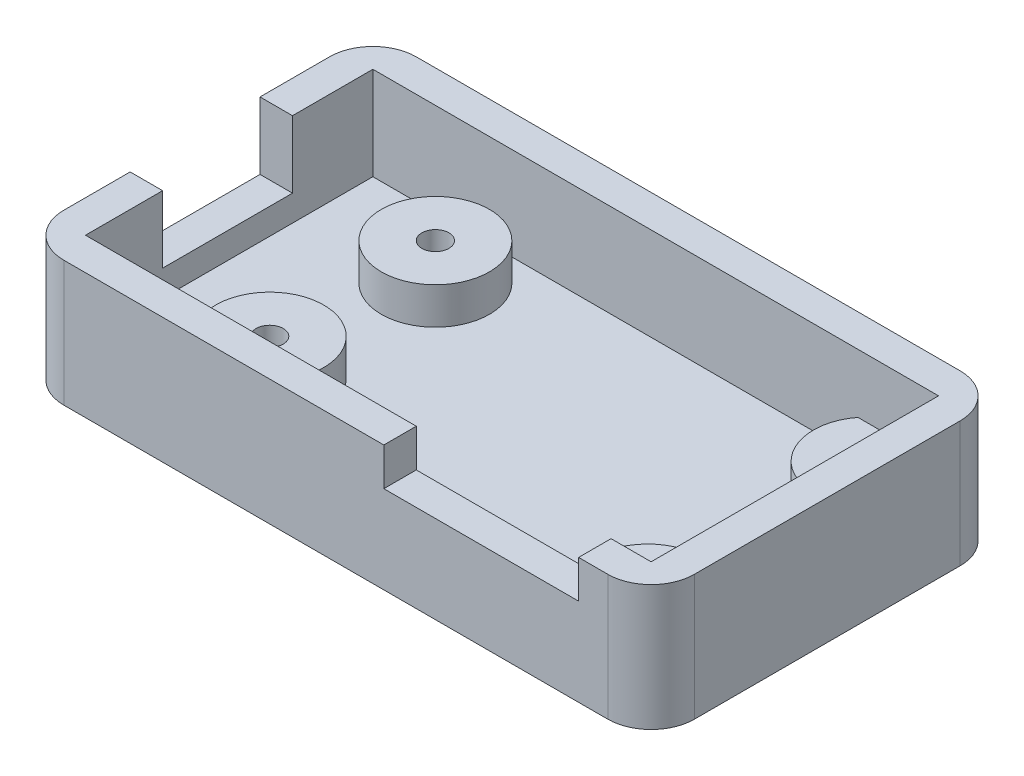
ISO-10303-21;
HEADER;
FILE_DESCRIPTION(('STEP AP214'),'2;1');
FILE_NAME('part.step','',(''),(''),'','','');
FILE_SCHEMA(('AUTOMOTIVE_DESIGN { 1 0 10303 214 1 1 1 1 }'));
ENDSEC;
DATA;
#1=APPLICATION_CONTEXT('core data for automotive mechanical design processes');
#2=APPLICATION_PROTOCOL_DEFINITION('international standard','automotive_design',2000,#1);
#3=PRODUCT_CONTEXT('',#1,'mechanical');
#4=PRODUCT('Part','Part','',(#3));
#5=PRODUCT_RELATED_PRODUCT_CATEGORY('part','',(#4));
#6=PRODUCT_DEFINITION_FORMATION('','',#4);
#7=PRODUCT_DEFINITION_CONTEXT('part definition',#1,'design');
#8=PRODUCT_DEFINITION('design','',#6,#7);
#9=PRODUCT_DEFINITION_SHAPE('','',#8);
#10=(LENGTH_UNIT() NAMED_UNIT(*) SI_UNIT(.MILLI.,.METRE.));
#11=(NAMED_UNIT(*) PLANE_ANGLE_UNIT() SI_UNIT($,.RADIAN.));
#12=(NAMED_UNIT(*) SI_UNIT($,.STERADIAN.) SOLID_ANGLE_UNIT());
#13=UNCERTAINTY_MEASURE_WITH_UNIT(LENGTH_MEASURE(1.E-05),#10,'distance_accuracy_value','');
#14=(GEOMETRIC_REPRESENTATION_CONTEXT(3) GLOBAL_UNCERTAINTY_ASSIGNED_CONTEXT((#13)) GLOBAL_UNIT_ASSIGNED_CONTEXT((#10,
#11,#12)) REPRESENTATION_CONTEXT('',''));
#15=CARTESIAN_POINT('',(0.,0.,0.));
#16=DIRECTION('',(0.,0.,1.));
#17=DIRECTION('',(1.,0.,0.));
#18=AXIS2_PLACEMENT_3D('',#15,#16,#17);
#19=CARTESIAN_POINT('',(-0.75,11.6,0.749999999999999));
#20=DIRECTION('',(0.,1.,0.));
#21=DIRECTION('',(0.,0.,1.));
#22=AXIS2_PLACEMENT_3D('',#19,#20,#21);
#23=PLANE('',#22);
#24=DIRECTION('',(1.,0.,0.));
#25=VECTOR('',#24,1.);
#26=CARTESIAN_POINT('',(-55.021,11.6,19.17934126));
#27=LINE('',#26,#25);
#28=CARTESIAN_POINT('',(-55.02,11.6,19.17934126));
#29=VERTEX_POINT('',#28);
#30=CARTESIAN_POINT('',(-52.02,11.6,19.17934126));
#31=VERTEX_POINT('',#30);
#32=EDGE_CURVE('E306',#29,#31,#27,.T.);
#33=ORIENTED_EDGE('',*,*,#32,.F.);
#34=DIRECTION('',(0.,0.,-1.));
#35=VECTOR('',#34,1.);
#36=CARTESIAN_POINT('',(-55.02,11.6,0.750000000000007));
#37=LINE('',#36,#35);
#38=CARTESIAN_POINT('',(-55.02,11.6,25.31));
#39=VERTEX_POINT('',#38);
#40=EDGE_CURVE('E311',#39,#29,#37,.T.);
#41=ORIENTED_EDGE('',*,*,#40,.F.);
#42=CARTESIAN_POINT('',(-51.02,11.6,25.31));
#43=DIRECTION('',(0.,1.,0.));
#44=DIRECTION('',(0.,0.,1.));
#45=AXIS2_PLACEMENT_3D('',#42,#43,#44);
#46=CIRCLE('',#45,4.);
#47=CARTESIAN_POINT('',(-51.02,11.6,29.31));
#48=VERTEX_POINT('',#47);
#49=EDGE_CURVE('E529',#39,#48,#46,.T.);
#50=ORIENTED_EDGE('',*,*,#49,.T.);
#51=DIRECTION('',(1.,0.,0.));
#52=VECTOR('',#51,1.);
#53=CARTESIAN_POINT('',(-51.02,11.6,29.31));
#54=LINE('',#53,#52);
#55=CARTESIAN_POINT('',(-21.45,11.6,29.31));
#56=VERTEX_POINT('',#55);
#57=EDGE_CURVE('E525',#48,#56,#54,.T.);
#58=ORIENTED_EDGE('',*,*,#57,.T.);
#59=DIRECTION('',(0.,0.,-1.));
#60=VECTOR('',#59,1.);
#61=CARTESIAN_POINT('',(-21.45,11.6,29.311));
#62=LINE('',#61,#60);
#63=CARTESIAN_POINT('',(-21.45,11.6,26.31));
#64=VERTEX_POINT('',#63);
#65=EDGE_CURVE('E356',#56,#64,#62,.T.);
#66=ORIENTED_EDGE('',*,*,#65,.T.);
#67=DIRECTION('',(1.,0.,0.));
#68=VECTOR('',#67,1.);
#69=CARTESIAN_POINT('',(-51.02,11.6,26.31));
#70=LINE('',#69,#68);
#71=CARTESIAN_POINT('',(-52.02,11.6,26.31));
#72=VERTEX_POINT('',#71);
#73=EDGE_CURVE('E477',#72,#64,#70,.T.);
#74=ORIENTED_EDGE('',*,*,#73,.F.);
#75=DIRECTION('',(0.,0.,-1.));
#76=VECTOR('',#75,1.);
#77=CARTESIAN_POINT('',(-52.02,11.6,0.750000000000006));
#78=LINE('',#77,#76);
#79=EDGE_CURVE('E463',#72,#31,#78,.T.);
#80=ORIENTED_EDGE('',*,*,#79,.T.);
#81=EDGE_LOOP('',(#33,#41,#50,#58,#66,#74,#80));
#82=FACE_BOUND('',#81,.T.);
#83=ADVANCED_FACE('F113',(#82),#23,.T.);
#84=CARTESIAN_POINT('',(-51.02,3.,0.750000000000006));
#85=DIRECTION('',(0.,1.,0.));
#86=DIRECTION('',(0.,0.,1.));
#87=AXIS2_PLACEMENT_3D('',#84,#85,#86);
#88=PLANE('',#87);
#89=DIRECTION('',(1.,0.,0.));
#90=VECTOR('',#89,1.);
#91=CARTESIAN_POINT('',(-51.02,3.,26.06));
#92=LINE('',#91,#90);
#93=CARTESIAN_POINT('',(-7.21608990664734,3.,26.06));
#94=VERTEX_POINT('',#93);
#95=CARTESIAN_POINT('',(0.,3.,26.06));
#96=VERTEX_POINT('',#95);
#97=EDGE_CURVE('E388',#94,#96,#92,.T.);
#98=ORIENTED_EDGE('',*,*,#97,.F.);
#99=CARTESIAN_POINT('',(-2.995,3.,23.38));
#100=DIRECTION('',(0.,1.,0.));
#101=DIRECTION('',(0.,0.,1.));
#102=AXIS2_PLACEMENT_3D('',#99,#100,#101);
#103=CIRCLE('',#102,5.);
#104=CARTESIAN_POINT('',(0.,3.,19.3762548782421));
#105=VERTEX_POINT('',#104);
#106=EDGE_CURVE('E372',#105,#94,#103,.T.);
#107=ORIENTED_EDGE('',*,*,#106,.F.);
#108=DIRECTION('',(0.,0.,-1.));
#109=VECTOR('',#108,1.);
#110=CARTESIAN_POINT('',(0.,3.,0.750000000000006));
#111=LINE('',#110,#109);
#112=EDGE_CURVE('E378',#96,#105,#111,.T.);
#113=ORIENTED_EDGE('',*,*,#112,.F.);
#114=EDGE_LOOP('',(#98,#107,#113));
#115=FACE_BOUND('',#114,.T.);
#116=CARTESIAN_POINT('',(-40.62,3.,20.685));
#117=DIRECTION('',(0.,1.,0.));
#118=DIRECTION('',(0.,0.,1.));
#119=AXIS2_PLACEMENT_3D('',#116,#117,#118);
#120=CIRCLE('',#119,5.);
#121=CARTESIAN_POINT('',(-40.62,3.,25.685));
#122=VERTEX_POINT('',#121);
#123=EDGE_CURVE('E407',#122,#122,#120,.T.);
#124=ORIENTED_EDGE('',*,*,#123,.F.);
#125=EDGE_LOOP('',(#124));
#126=FACE_BOUND('',#125,.T.);
#127=CARTESIAN_POINT('',(-40.62,3.,5.375));
#128=DIRECTION('',(0.,1.,0.));
#129=DIRECTION('',(0.,0.,1.));
#130=AXIS2_PLACEMENT_3D('',#127,#128,#129);
#131=CIRCLE('',#130,5.);
#132=CARTESIAN_POINT('',(-40.62,3.,10.375));
#133=VERTEX_POINT('',#132);
#134=EDGE_CURVE('E419',#133,#133,#131,.T.);
#135=ORIENTED_EDGE('',*,*,#134,.F.);
#136=EDGE_LOOP('',(#135));
#137=FACE_BOUND('',#136,.T.);
#138=DIRECTION('',(1.,0.,0.));
#139=VECTOR('',#138,1.);
#140=CARTESIAN_POINT('',(-51.02,3.,-0.25));
#141=LINE('',#140,#139);
#142=CARTESIAN_POINT('',(-52.02,3.,-0.25));
#143=VERTEX_POINT('',#142);
#144=CARTESIAN_POINT('',(0.25,3.,-0.249999999999999));
#145=VERTEX_POINT('',#144);
#146=EDGE_CURVE('E485',#143,#145,#141,.T.);
#147=ORIENTED_EDGE('',*,*,#146,.F.);
#148=DIRECTION('',(0.,0.,-1.));
#149=VECTOR('',#148,1.);
#150=CARTESIAN_POINT('',(-52.02,3.,0.750000000000006));
#151=LINE('',#150,#149);
#152=CARTESIAN_POINT('',(-52.02,3.,26.31));
#153=VERTEX_POINT('',#152);
#154=EDGE_CURVE('E457',#153,#143,#151,.T.);
#155=ORIENTED_EDGE('',*,*,#154,.F.);
#156=DIRECTION('',(1.,0.,0.));
#157=VECTOR('',#156,1.);
#158=CARTESIAN_POINT('',(-51.02,3.,26.31));
#159=LINE('',#158,#157);
#160=CARTESIAN_POINT('',(0.25,3.,26.31));
#161=VERTEX_POINT('',#160);
#162=EDGE_CURVE('E493',#153,#161,#159,.T.);
#163=ORIENTED_EDGE('',*,*,#162,.T.);
#164=DIRECTION('',(0.,0.,-1.));
#165=VECTOR('',#164,1.);
#166=CARTESIAN_POINT('',(0.25,3.,0.750000000000006));
#167=LINE('',#166,#165);
#168=EDGE_CURVE('E489',#161,#145,#167,.T.);
#169=ORIENTED_EDGE('',*,*,#168,.T.);
#170=EDGE_LOOP('',(#147,#155,#163,#169));
#171=FACE_BOUND('',#170,.T.);
#172=DIRECTION('',(1.,0.,0.));
#173=VECTOR('',#172,1.);
#174=CARTESIAN_POINT('',(-51.02,3.,0.));
#175=LINE('',#174,#173);
#176=CARTESIAN_POINT('',(-6.94928881089887,3.,0.));
#177=VERTEX_POINT('',#176);
#178=CARTESIAN_POINT('',(0.,3.,0.));
#179=VERTEX_POINT('',#178);
#180=EDGE_CURVE('E431',#177,#179,#175,.T.);
#181=ORIENTED_EDGE('',*,*,#180,.T.);
#182=DIRECTION('',(0.,0.,-1.));
#183=VECTOR('',#182,1.);
#184=CARTESIAN_POINT('',(0.,3.,0.750000000000006));
#185=LINE('',#184,#183);
#186=CARTESIAN_POINT('',(0.,3.,7.06374512175788));
#187=VERTEX_POINT('',#186);
#188=EDGE_CURVE('E447',#187,#179,#185,.T.);
#189=ORIENTED_EDGE('',*,*,#188,.F.);
#190=CARTESIAN_POINT('',(-2.995,3.,3.06));
#191=DIRECTION('',(0.,1.,0.));
#192=DIRECTION('',(0.,0.,1.));
#193=AXIS2_PLACEMENT_3D('',#190,#191,#192);
#194=CIRCLE('',#193,5.);
#195=EDGE_CURVE('E437',#177,#187,#194,.T.);
#196=ORIENTED_EDGE('',*,*,#195,.F.);
#197=EDGE_LOOP('',(#181,#189,#196));
#198=FACE_BOUND('',#197,.T.);
#199=ADVANCED_FACE('F642',(#115,#126,#137,#171,#198),#88,.T.);
#200=CARTESIAN_POINT('',(-51.02,3.,0.750000000000006));
#201=DIRECTION('',(0.,-1.,0.));
#202=DIRECTION('',(0.,0.,-1.));
#203=AXIS2_PLACEMENT_3D('',#200,#201,#202);
#204=CYLINDRICAL_SURFACE('',#203,4.);
#205=CARTESIAN_POINT('',(-51.02,0.,0.750000000000006));
#206=DIRECTION('',(0.,1.,0.));
#207=DIRECTION('',(0.,0.,1.));
#208=AXIS2_PLACEMENT_3D('',#205,#206,#207);
#209=CIRCLE('',#208,4.);
#210=CARTESIAN_POINT('',(-51.02,0.,-3.24999999999999));
#211=VERTEX_POINT('',#210);
#212=CARTESIAN_POINT('',(-55.02,0.,0.750000000000035));
#213=VERTEX_POINT('',#212);
#214=EDGE_CURVE('E540',#211,#213,#209,.T.);
#215=ORIENTED_EDGE('',*,*,#214,.T.);
#216=DIRECTION('',(0.,-1.,0.));
#217=VECTOR('',#216,1.);
#218=CARTESIAN_POINT('',(-55.02,3.,0.750000000000035));
#219=LINE('',#218,#217);
#220=CARTESIAN_POINT('',(-55.02,11.6,0.750000000000034));
#221=VERTEX_POINT('',#220);
#222=EDGE_CURVE('E12',#221,#213,#219,.T.);
#223=ORIENTED_EDGE('',*,*,#222,.F.);
#224=CARTESIAN_POINT('',(-51.02,11.6,0.750000000000006));
#225=DIRECTION('',(0.,1.,0.));
#226=DIRECTION('',(0.,0.,1.));
#227=AXIS2_PLACEMENT_3D('',#224,#225,#226);
#228=CIRCLE('',#227,4.);
#229=CARTESIAN_POINT('',(-51.02,11.6,-3.24999999999999));
#230=VERTEX_POINT('',#229);
#231=EDGE_CURVE('E536',#230,#221,#228,.T.);
#232=ORIENTED_EDGE('',*,*,#231,.F.);
#233=DIRECTION('',(0.,-1.,0.));
#234=VECTOR('',#233,1.);
#235=CARTESIAN_POINT('',(-51.02,3.,-3.24999999999999));
#236=LINE('',#235,#234);
#237=EDGE_CURVE('E570',#230,#211,#236,.T.);
#238=ORIENTED_EDGE('',*,*,#237,.T.);
#239=EDGE_LOOP('',(#215,#223,#232,#238));
#240=FACE_BOUND('',#239,.T.);
#241=ADVANCED_FACE('F115',(#240),#204,.T.);
#242=CARTESIAN_POINT('',(-55.02,3.,0.750000000000035));
#243=DIRECTION('',(1.,0.,0.));
#244=DIRECTION('',(0.,0.,-1.));
#245=AXIS2_PLACEMENT_3D('',#242,#243,#244);
#246=PLANE('',#245);
#247=ORIENTED_EDGE('',*,*,#40,.T.);
#248=DIRECTION('',(0.,1.,0.));
#249=VECTOR('',#248,1.);
#250=CARTESIAN_POINT('',(-55.02,11.6,19.17934126));
#251=LINE('',#250,#249);
#252=CARTESIAN_POINT('',(-55.02,5.4,19.17934126));
#253=VERTEX_POINT('',#252);
#254=EDGE_CURVE('E289',#253,#29,#251,.T.);
#255=ORIENTED_EDGE('',*,*,#254,.F.);
#256=DIRECTION('',(0.,0.,1.));
#257=VECTOR('',#256,1.);
#258=CARTESIAN_POINT('',(-55.02,5.4,19.17934126));
#259=LINE('',#258,#257);
#260=CARTESIAN_POINT('',(-55.02,5.4,7.17934126));
#261=VERTEX_POINT('',#260);
#262=EDGE_CURVE('E299',#261,#253,#259,.T.);
#263=ORIENTED_EDGE('',*,*,#262,.F.);
#264=DIRECTION('',(0.,-1.,0.));
#265=VECTOR('',#264,1.);
#266=CARTESIAN_POINT('',(-55.02,11.6,7.17934126));
#267=LINE('',#266,#265);
#268=CARTESIAN_POINT('',(-55.02,11.6,7.17934126));
#269=VERTEX_POINT('',#268);
#270=EDGE_CURVE('E313',#269,#261,#267,.T.);
#271=ORIENTED_EDGE('',*,*,#270,.F.);
#272=EDGE_CURVE('E533',#269,#221,#37,.T.);
#273=ORIENTED_EDGE('',*,*,#272,.T.);
#274=ORIENTED_EDGE('',*,*,#222,.T.);
#275=DIRECTION('',(0.,0.,1.));
#276=VECTOR('',#275,1.);
#277=CARTESIAN_POINT('',(-55.02,0.,0.750000000000035));
#278=LINE('',#277,#276);
#279=CARTESIAN_POINT('',(-55.02,0.,25.31));
#280=VERTEX_POINT('',#279);
#281=EDGE_CURVE('E544',#213,#280,#278,.T.);
#282=ORIENTED_EDGE('',*,*,#281,.T.);
#283=DIRECTION('',(0.,-1.,0.));
#284=VECTOR('',#283,1.);
#285=CARTESIAN_POINT('',(-55.02,3.,25.31));
#286=LINE('',#285,#284);
#287=EDGE_CURVE('E122',#39,#280,#286,.T.);
#288=ORIENTED_EDGE('',*,*,#287,.F.);
#289=EDGE_LOOP('',(#247,#255,#263,#271,#273,#274,#282,#288));
#290=FACE_BOUND('',#289,.T.);
#291=ADVANCED_FACE('F309',(#290),#246,.F.);
#292=CARTESIAN_POINT('',(-51.02,3.,25.31));
#293=DIRECTION('',(0.,-1.,0.));
#294=DIRECTION('',(0.,0.,-1.));
#295=AXIS2_PLACEMENT_3D('',#292,#293,#294);
#296=CYLINDRICAL_SURFACE('',#295,4.);
#297=CARTESIAN_POINT('',(-51.02,0.,25.31));
#298=DIRECTION('',(0.,1.,0.));
#299=DIRECTION('',(0.,0.,1.));
#300=AXIS2_PLACEMENT_3D('',#297,#298,#299);
#301=CIRCLE('',#300,4.);
#302=CARTESIAN_POINT('',(-51.02,0.,29.31));
#303=VERTEX_POINT('',#302);
#304=EDGE_CURVE('E547',#280,#303,#301,.T.);
#305=ORIENTED_EDGE('',*,*,#304,.T.);
#306=DIRECTION('',(0.,-1.,0.));
#307=VECTOR('',#306,1.);
#308=CARTESIAN_POINT('',(-51.02,3.,29.31));
#309=LINE('',#308,#307);
#310=EDGE_CURVE('E586',#48,#303,#309,.T.);
#311=ORIENTED_EDGE('',*,*,#310,.F.);
#312=ORIENTED_EDGE('',*,*,#49,.F.);
#313=ORIENTED_EDGE('',*,*,#287,.T.);
#314=EDGE_LOOP('',(#305,#311,#312,#313));
#315=FACE_BOUND('',#314,.T.);
#316=ADVANCED_FACE('F593',(#315),#296,.T.);
#317=CARTESIAN_POINT('',(-0.750000000000025,3.,29.31));
#318=DIRECTION('',(0.,0.,1.));
#319=DIRECTION('',(1.,0.,0.));
#320=AXIS2_PLACEMENT_3D('',#317,#318,#319);
#321=PLANE('',#320);
#322=DIRECTION('',(0.,-1.,0.));
#323=VECTOR('',#322,1.);
#324=CARTESIAN_POINT('',(-3.45,11.6,29.31));
#325=LINE('',#324,#323);
#326=CARTESIAN_POINT('',(-3.45,11.6,29.31));
#327=VERTEX_POINT('',#326);
#328=CARTESIAN_POINT('',(-3.45,8.1,29.31));
#329=VERTEX_POINT('',#328);
#330=EDGE_CURVE('E338',#327,#329,#325,.T.);
#331=ORIENTED_EDGE('',*,*,#330,.T.);
#332=DIRECTION('',(-1.,0.,0.));
#333=VECTOR('',#332,1.);
#334=CARTESIAN_POINT('',(-3.45,8.1,29.31));
#335=LINE('',#334,#333);
#336=CARTESIAN_POINT('',(-21.45,8.1,29.31));
#337=VERTEX_POINT('',#336);
#338=EDGE_CURVE('E355',#329,#337,#335,.T.);
#339=ORIENTED_EDGE('',*,*,#338,.T.);
#340=DIRECTION('',(0.,1.,0.));
#341=VECTOR('',#340,1.);
#342=CARTESIAN_POINT('',(-21.45,11.6,29.31));
#343=LINE('',#342,#341);
#344=EDGE_CURVE('E305',#337,#56,#343,.T.);
#345=ORIENTED_EDGE('',*,*,#344,.T.);
#346=ORIENTED_EDGE('',*,*,#57,.F.);
#347=ORIENTED_EDGE('',*,*,#310,.T.);
#348=DIRECTION('',(-1.,0.,0.));
#349=VECTOR('',#348,1.);
#350=CARTESIAN_POINT('',(-0.750000000000025,0.,29.31));
#351=LINE('',#350,#349);
#352=CARTESIAN_POINT('',(-0.750000000000025,0.,29.31));
#353=VERTEX_POINT('',#352);
#354=EDGE_CURVE('E551',#353,#303,#351,.T.);
#355=ORIENTED_EDGE('',*,*,#354,.F.);
#356=DIRECTION('',(0.,-1.,0.));
#357=VECTOR('',#356,1.);
#358=CARTESIAN_POINT('',(-0.750000000000025,3.,29.31));
#359=LINE('',#358,#357);
#360=CARTESIAN_POINT('',(-0.750000000000028,11.6,29.31));
#361=VERTEX_POINT('',#360);
#362=EDGE_CURVE('E583',#361,#353,#359,.T.);
#363=ORIENTED_EDGE('',*,*,#362,.F.);
#364=EDGE_CURVE('E524',#327,#361,#54,.T.);
#365=ORIENTED_EDGE('',*,*,#364,.F.);
#366=EDGE_LOOP('',(#331,#339,#345,#346,#347,#355,#363,#365));
#367=FACE_BOUND('',#366,.T.);
#368=ADVANCED_FACE('F601',(#367),#321,.T.);
#369=CARTESIAN_POINT('',(-0.749999999999997,3.,25.31));
#370=DIRECTION('',(0.,-1.,0.));
#371=DIRECTION('',(0.,0.,-1.));
#372=AXIS2_PLACEMENT_3D('',#369,#370,#371);
#373=CYLINDRICAL_SURFACE('',#372,4.);
#374=CARTESIAN_POINT('',(-0.749999999999997,0.,25.31));
#375=DIRECTION('',(0.,1.,0.));
#376=DIRECTION('',(0.,0.,1.));
#377=AXIS2_PLACEMENT_3D('',#374,#375,#376);
#378=CIRCLE('',#377,4.);
#379=CARTESIAN_POINT('',(3.25,0.,25.31));
#380=VERTEX_POINT('',#379);
#381=EDGE_CURVE('E555',#353,#380,#378,.T.);
#382=ORIENTED_EDGE('',*,*,#381,.T.);
#383=DIRECTION('',(0.,-1.,0.));
#384=VECTOR('',#383,1.);
#385=CARTESIAN_POINT('',(3.25,3.,25.31));
#386=LINE('',#385,#384);
#387=CARTESIAN_POINT('',(3.25,11.6,25.31));
#388=VERTEX_POINT('',#387);
#389=EDGE_CURVE('E580',#388,#380,#386,.T.);
#390=ORIENTED_EDGE('',*,*,#389,.F.);
#391=CARTESIAN_POINT('',(-0.749999999999997,11.6,25.31));
#392=DIRECTION('',(0.,1.,0.));
#393=DIRECTION('',(0.,0.,1.));
#394=AXIS2_PLACEMENT_3D('',#391,#392,#393);
#395=CIRCLE('',#394,4.);
#396=EDGE_CURVE('E520',#361,#388,#395,.T.);
#397=ORIENTED_EDGE('',*,*,#396,.F.);
#398=ORIENTED_EDGE('',*,*,#362,.T.);
#399=EDGE_LOOP('',(#382,#390,#397,#398));
#400=FACE_BOUND('',#399,.T.);
#401=ADVANCED_FACE('F694',(#400),#373,.T.);
#402=CARTESIAN_POINT('',(3.25,3.,0.750000000000028));
#403=DIRECTION('',(1.,0.,0.));
#404=DIRECTION('',(0.,0.,-1.));
#405=AXIS2_PLACEMENT_3D('',#402,#403,#404);
#406=PLANE('',#405);
#407=DIRECTION('',(0.,0.,1.));
#408=VECTOR('',#407,1.);
#409=CARTESIAN_POINT('',(3.25,0.,0.750000000000028));
#410=LINE('',#409,#408);
#411=CARTESIAN_POINT('',(3.25,0.,0.750000000000028));
#412=VERTEX_POINT('',#411);
#413=EDGE_CURVE('E559',#412,#380,#410,.T.);
#414=ORIENTED_EDGE('',*,*,#413,.F.);
#415=DIRECTION('',(0.,-1.,0.));
#416=VECTOR('',#415,1.);
#417=CARTESIAN_POINT('',(3.25,3.,0.750000000000028));
#418=LINE('',#417,#416);
#419=CARTESIAN_POINT('',(3.25,11.6,0.750000000000027));
#420=VERTEX_POINT('',#419);
#421=EDGE_CURVE('E577',#420,#412,#418,.T.);
#422=ORIENTED_EDGE('',*,*,#421,.F.);
#423=DIRECTION('',(0.,0.,-1.));
#424=VECTOR('',#423,1.);
#425=CARTESIAN_POINT('',(3.25,11.6,0.749999999999999));
#426=LINE('',#425,#424);
#427=EDGE_CURVE('E516',#388,#420,#426,.T.);
#428=ORIENTED_EDGE('',*,*,#427,.F.);
#429=ORIENTED_EDGE('',*,*,#389,.T.);
#430=EDGE_LOOP('',(#414,#422,#428,#429));
#431=FACE_BOUND('',#430,.T.);
#432=ADVANCED_FACE('F656',(#431),#406,.T.);
#433=CARTESIAN_POINT('',(-0.75,3.,0.749999999999999));
#434=DIRECTION('',(0.,-1.,0.));
#435=DIRECTION('',(0.,0.,-1.));
#436=AXIS2_PLACEMENT_3D('',#433,#434,#435);
#437=CYLINDRICAL_SURFACE('',#436,4.);
#438=CARTESIAN_POINT('',(-0.75,0.,0.749999999999999));
#439=DIRECTION('',(0.,-1.,0.));
#440=DIRECTION('',(0.,0.,-1.));
#441=AXIS2_PLACEMENT_3D('',#438,#439,#440);
#442=CIRCLE('',#441,4.);
#443=CARTESIAN_POINT('',(-0.750000000000028,0.,-3.25));
#444=VERTEX_POINT('',#443);
#445=EDGE_CURVE('E563',#444,#412,#442,.T.);
#446=ORIENTED_EDGE('',*,*,#445,.F.);
#447=DIRECTION('',(0.,-1.,0.));
#448=VECTOR('',#447,1.);
#449=CARTESIAN_POINT('',(-0.750000000000028,3.,-3.25));
#450=LINE('',#449,#448);
#451=CARTESIAN_POINT('',(-0.750000000000028,11.6,-3.25));
#452=VERTEX_POINT('',#451);
#453=EDGE_CURVE('E574',#452,#444,#450,.T.);
#454=ORIENTED_EDGE('',*,*,#453,.F.);
#455=CARTESIAN_POINT('',(-0.75,11.6,0.749999999999999));
#456=DIRECTION('',(0.,1.,0.));
#457=DIRECTION('',(0.,0.,1.));
#458=AXIS2_PLACEMENT_3D('',#455,#456,#457);
#459=CIRCLE('',#458,4.);
#460=EDGE_CURVE('E512',#420,#452,#459,.T.);
#461=ORIENTED_EDGE('',*,*,#460,.F.);
#462=ORIENTED_EDGE('',*,*,#421,.T.);
#463=EDGE_LOOP('',(#446,#454,#461,#462));
#464=FACE_BOUND('',#463,.T.);
#465=ADVANCED_FACE('F659',(#464),#437,.T.);
#466=CARTESIAN_POINT('',(-0.750000000000028,3.,-3.25));
#467=DIRECTION('',(0.,0.,1.));
#468=DIRECTION('',(1.,0.,0.));
#469=AXIS2_PLACEMENT_3D('',#466,#467,#468);
#470=PLANE('',#469);
#471=DIRECTION('',(-1.,0.,0.));
#472=VECTOR('',#471,1.);
#473=CARTESIAN_POINT('',(-0.750000000000028,0.,-3.25));
#474=LINE('',#473,#472);
#475=EDGE_CURVE('E567',#444,#211,#474,.T.);
#476=ORIENTED_EDGE('',*,*,#475,.T.);
#477=ORIENTED_EDGE('',*,*,#237,.F.);
#478=DIRECTION('',(1.,0.,0.));
#479=VECTOR('',#478,1.);
#480=CARTESIAN_POINT('',(-51.02,11.6,-3.24999999999999));
#481=LINE('',#480,#479);
#482=EDGE_CURVE('E500',#230,#452,#481,.T.);
#483=ORIENTED_EDGE('',*,*,#482,.T.);
#484=ORIENTED_EDGE('',*,*,#453,.T.);
#485=EDGE_LOOP('',(#476,#477,#483,#484));
#486=FACE_BOUND('',#485,.T.);
#487=ADVANCED_FACE('F661',(#486),#470,.F.);
#488=CARTESIAN_POINT('',(-51.02,0.,0.750000000000006));
#489=DIRECTION('',(0.,1.,0.));
#490=DIRECTION('',(0.,0.,1.));
#491=AXIS2_PLACEMENT_3D('',#488,#489,#490);
#492=PLANE('',#491);
#493=CARTESIAN_POINT('',(-2.995,0.,23.38));
#494=DIRECTION('',(0.,1.,0.));
#495=DIRECTION('',(0.,0.,1.));
#496=AXIS2_PLACEMENT_3D('',#493,#494,#495);
#497=CIRCLE('',#496,1.25);
#498=CARTESIAN_POINT('',(-2.995,0.,24.63));
#499=VERTEX_POINT('',#498);
#500=EDGE_CURVE('E319',#499,#499,#497,.T.);
#501=ORIENTED_EDGE('',*,*,#500,.T.);
#502=EDGE_LOOP('',(#501));
#503=FACE_BOUND('',#502,.T.);
#504=CARTESIAN_POINT('',(-2.995,0.,3.06));
#505=DIRECTION('',(0.,1.,0.));
#506=DIRECTION('',(0.,0.,1.));
#507=AXIS2_PLACEMENT_3D('',#504,#505,#506);
#508=CIRCLE('',#507,1.25);
#509=CARTESIAN_POINT('',(-2.995,0.,4.31));
#510=VERTEX_POINT('',#509);
#511=EDGE_CURVE('E1065',#510,#510,#508,.T.);
#512=ORIENTED_EDGE('',*,*,#511,.T.);
#513=EDGE_LOOP('',(#512));
#514=FACE_BOUND('',#513,.T.);
#515=CARTESIAN_POINT('',(-40.62,0.,5.375));
#516=DIRECTION('',(0.,1.,0.));
#517=DIRECTION('',(0.,0.,1.));
#518=AXIS2_PLACEMENT_3D('',#515,#516,#517);
#519=CIRCLE('',#518,1.25);
#520=CARTESIAN_POINT('',(-40.62,0.,6.625));
#521=VERTEX_POINT('',#520);
#522=EDGE_CURVE('E1067',#521,#521,#519,.T.);
#523=ORIENTED_EDGE('',*,*,#522,.T.);
#524=EDGE_LOOP('',(#523));
#525=FACE_BOUND('',#524,.T.);
#526=CARTESIAN_POINT('',(-40.62,0.,20.685));
#527=DIRECTION('',(0.,1.,0.));
#528=DIRECTION('',(0.,0.,1.));
#529=AXIS2_PLACEMENT_3D('',#526,#527,#528);
#530=CIRCLE('',#529,1.25);
#531=CARTESIAN_POINT('',(-40.62,0.,21.935));
#532=VERTEX_POINT('',#531);
#533=EDGE_CURVE('E1073',#532,#532,#530,.T.);
#534=ORIENTED_EDGE('',*,*,#533,.T.);
#535=EDGE_LOOP('',(#534));
#536=FACE_BOUND('',#535,.T.);
#537=ORIENTED_EDGE('',*,*,#214,.F.);
#538=ORIENTED_EDGE('',*,*,#475,.F.);
#539=ORIENTED_EDGE('',*,*,#445,.T.);
#540=ORIENTED_EDGE('',*,*,#413,.T.);
#541=ORIENTED_EDGE('',*,*,#381,.F.);
#542=ORIENTED_EDGE('',*,*,#354,.T.);
#543=ORIENTED_EDGE('',*,*,#304,.F.);
#544=ORIENTED_EDGE('',*,*,#281,.F.);
#545=EDGE_LOOP('',(#537,#538,#539,#540,#541,#542,#543,#544));
#546=FACE_BOUND('',#545,.T.);
#547=ADVANCED_FACE('F596',(#503,#514,#525,#536,#546),#492,.F.);
#548=DIRECTION('',(1.,0.,0.));
#549=VECTOR('',#548,1.);
#550=CARTESIAN_POINT('',(-55.021,11.6,7.17934126));
#551=LINE('',#550,#549);
#552=CARTESIAN_POINT('',(-52.02,11.6,7.17934126));
#553=VERTEX_POINT('',#552);
#554=EDGE_CURVE('E329',#269,#553,#551,.T.);
#555=ORIENTED_EDGE('',*,*,#554,.T.);
#556=CARTESIAN_POINT('',(-52.02,11.6,-0.25));
#557=VERTEX_POINT('',#556);
#558=EDGE_CURVE('E468',#553,#557,#78,.T.);
#559=ORIENTED_EDGE('',*,*,#558,.T.);
#560=DIRECTION('',(1.,0.,0.));
#561=VECTOR('',#560,1.);
#562=CARTESIAN_POINT('',(-51.02,11.6,-0.25));
#563=LINE('',#562,#561);
#564=CARTESIAN_POINT('',(0.25,11.6,-0.25));
#565=VERTEX_POINT('',#564);
#566=EDGE_CURVE('E467',#557,#565,#563,.T.);
#567=ORIENTED_EDGE('',*,*,#566,.T.);
#568=DIRECTION('',(0.,0.,-1.));
#569=VECTOR('',#568,1.);
#570=CARTESIAN_POINT('',(0.25,11.6,0.750000000000006));
#571=LINE('',#570,#569);
#572=CARTESIAN_POINT('',(0.25,11.6,26.31));
#573=VERTEX_POINT('',#572);
#574=EDGE_CURVE('E472',#573,#565,#571,.T.);
#575=ORIENTED_EDGE('',*,*,#574,.F.);
#576=CARTESIAN_POINT('',(-3.45000000000001,11.6,26.31));
#577=VERTEX_POINT('',#576);
#578=EDGE_CURVE('E476',#577,#573,#70,.T.);
#579=ORIENTED_EDGE('',*,*,#578,.F.);
#580=DIRECTION('',(0.,0.,-1.));
#581=VECTOR('',#580,1.);
#582=CARTESIAN_POINT('',(-3.45,11.6,29.311));
#583=LINE('',#582,#581);
#584=EDGE_CURVE('E352',#327,#577,#583,.T.);
#585=ORIENTED_EDGE('',*,*,#584,.F.);
#586=ORIENTED_EDGE('',*,*,#364,.T.);
#587=ORIENTED_EDGE('',*,*,#396,.T.);
#588=ORIENTED_EDGE('',*,*,#427,.T.);
#589=ORIENTED_EDGE('',*,*,#460,.T.);
#590=ORIENTED_EDGE('',*,*,#482,.F.);
#591=ORIENTED_EDGE('',*,*,#231,.T.);
#592=ORIENTED_EDGE('',*,*,#272,.F.);
#593=EDGE_LOOP('',(#555,#559,#567,#575,#579,#585,#586,#587,#588,#589,#590,#591,#592));
#594=FACE_BOUND('',#593,.T.);
#595=ADVANCED_FACE('F617',(#594),#23,.T.);
#596=CARTESIAN_POINT('',(-52.02,11.6,0.750000000000006));
#597=DIRECTION('',(-1.,0.,0.));
#598=DIRECTION('',(0.,0.,1.));
#599=AXIS2_PLACEMENT_3D('',#596,#597,#598);
#600=PLANE('',#599);
#601=DIRECTION('',(0.,0.,-1.));
#602=VECTOR('',#601,1.);
#603=CARTESIAN_POINT('',(-52.02,5.4,19.17934126));
#604=LINE('',#603,#602);
#605=CARTESIAN_POINT('',(-52.02,5.4,19.17934126));
#606=VERTEX_POINT('',#605);
#607=CARTESIAN_POINT('',(-52.02,5.4,7.17934126));
#608=VERTEX_POINT('',#607);
#609=EDGE_CURVE('E317',#606,#608,#604,.T.);
#610=ORIENTED_EDGE('',*,*,#609,.F.);
#611=DIRECTION('',(0.,-1.,0.));
#612=VECTOR('',#611,1.);
#613=CARTESIAN_POINT('',(-52.02,11.6,19.17934126));
#614=LINE('',#613,#612);
#615=EDGE_CURVE('E129',#31,#606,#614,.T.);
#616=ORIENTED_EDGE('',*,*,#615,.F.);
#617=ORIENTED_EDGE('',*,*,#79,.F.);
#618=DIRECTION('',(0.,-1.,0.));
#619=VECTOR('',#618,1.);
#620=CARTESIAN_POINT('',(-52.02,11.6,26.31));
#621=LINE('',#620,#619);
#622=EDGE_CURVE('E497',#72,#153,#621,.T.);
#623=ORIENTED_EDGE('',*,*,#622,.T.);
#624=ORIENTED_EDGE('',*,*,#154,.T.);
#625=DIRECTION('',(0.,-1.,0.));
#626=VECTOR('',#625,1.);
#627=CARTESIAN_POINT('',(-52.02,11.6,-0.25));
#628=LINE('',#627,#626);
#629=EDGE_CURVE('E481',#557,#143,#628,.T.);
#630=ORIENTED_EDGE('',*,*,#629,.F.);
#631=ORIENTED_EDGE('',*,*,#558,.F.);
#632=DIRECTION('',(0.,1.,0.));
#633=VECTOR('',#632,1.);
#634=CARTESIAN_POINT('',(-52.02,11.6,7.17934126));
#635=LINE('',#634,#633);
#636=EDGE_CURVE('E296',#608,#553,#635,.T.);
#637=ORIENTED_EDGE('',*,*,#636,.F.);
#638=EDGE_LOOP('',(#610,#616,#617,#623,#624,#630,#631,#637));
#639=FACE_BOUND('',#638,.T.);
#640=ADVANCED_FACE('F609',(#639),#600,.F.);
#641=CARTESIAN_POINT('',(-51.02,11.6,26.31));
#642=DIRECTION('',(0.,0.,-1.));
#643=DIRECTION('',(-1.,0.,0.));
#644=AXIS2_PLACEMENT_3D('',#641,#642,#643);
#645=PLANE('',#644);
#646=DIRECTION('',(0.,-1.,0.));
#647=VECTOR('',#646,1.);
#648=CARTESIAN_POINT('',(-3.45000000000001,11.6,26.31));
#649=LINE('',#648,#647);
#650=CARTESIAN_POINT('',(-3.45,8.1,26.31));
#651=VERTEX_POINT('',#650);
#652=EDGE_CURVE('E137',#577,#651,#649,.T.);
#653=ORIENTED_EDGE('',*,*,#652,.F.);
#654=ORIENTED_EDGE('',*,*,#578,.T.);
#655=DIRECTION('',(0.,-1.,0.));
#656=VECTOR('',#655,1.);
#657=CARTESIAN_POINT('',(0.25,11.6,26.31));
#658=LINE('',#657,#656);
#659=EDGE_CURVE('E501',#573,#161,#658,.T.);
#660=ORIENTED_EDGE('',*,*,#659,.T.);
#661=ORIENTED_EDGE('',*,*,#162,.F.);
#662=ORIENTED_EDGE('',*,*,#622,.F.);
#663=ORIENTED_EDGE('',*,*,#73,.T.);
#664=DIRECTION('',(0.,1.,0.));
#665=VECTOR('',#664,1.);
#666=CARTESIAN_POINT('',(-21.45,11.6,26.31));
#667=LINE('',#666,#665);
#668=CARTESIAN_POINT('',(-21.45,8.1,26.31));
#669=VERTEX_POINT('',#668);
#670=EDGE_CURVE('E348',#669,#64,#667,.T.);
#671=ORIENTED_EDGE('',*,*,#670,.F.);
#672=DIRECTION('',(-1.,0.,0.));
#673=VECTOR('',#672,1.);
#674=CARTESIAN_POINT('',(-3.45,8.1,26.31));
#675=LINE('',#674,#673);
#676=EDGE_CURVE('E344',#651,#669,#675,.T.);
#677=ORIENTED_EDGE('',*,*,#676,.F.);
#678=EDGE_LOOP('',(#653,#654,#660,#661,#662,#663,#671,#677));
#679=FACE_BOUND('',#678,.T.);
#680=ADVANCED_FACE('F628',(#679),#645,.T.);
#681=CARTESIAN_POINT('',(0.25,11.6,0.750000000000006));
#682=DIRECTION('',(-1.,0.,0.));
#683=DIRECTION('',(0.,0.,1.));
#684=AXIS2_PLACEMENT_3D('',#681,#682,#683);
#685=PLANE('',#684);
#686=ORIENTED_EDGE('',*,*,#168,.F.);
#687=ORIENTED_EDGE('',*,*,#659,.F.);
#688=ORIENTED_EDGE('',*,*,#574,.T.);
#689=DIRECTION('',(0.,-1.,0.));
#690=VECTOR('',#689,1.);
#691=CARTESIAN_POINT('',(0.25,11.6,-0.249999999999999));
#692=LINE('',#691,#690);
#693=EDGE_CURVE('E504',#565,#145,#692,.T.);
#694=ORIENTED_EDGE('',*,*,#693,.T.);
#695=EDGE_LOOP('',(#686,#687,#688,#694));
#696=FACE_BOUND('',#695,.T.);
#697=ADVANCED_FACE('F635',(#696),#685,.T.);
#698=CARTESIAN_POINT('',(-51.02,11.6,-0.25));
#699=DIRECTION('',(0.,0.,-1.));
#700=DIRECTION('',(-1.,0.,0.));
#701=AXIS2_PLACEMENT_3D('',#698,#699,#700);
#702=PLANE('',#701);
#703=ORIENTED_EDGE('',*,*,#146,.T.);
#704=ORIENTED_EDGE('',*,*,#693,.F.);
#705=ORIENTED_EDGE('',*,*,#566,.F.);
#706=ORIENTED_EDGE('',*,*,#629,.T.);
#707=EDGE_LOOP('',(#703,#704,#705,#706));
#708=FACE_BOUND('',#707,.T.);
#709=ADVANCED_FACE('F638',(#708),#702,.F.);
#710=CARTESIAN_POINT('',(-2.995,6.4,3.06));
#711=DIRECTION('',(0.,1.,0.));
#712=DIRECTION('',(0.,0.,1.));
#713=AXIS2_PLACEMENT_3D('',#710,#711,#712);
#714=PLANE('',#713);
#715=DIRECTION('',(1.,0.,0.));
#716=VECTOR('',#715,1.);
#717=CARTESIAN_POINT('',(-51.02,6.4,0.));
#718=LINE('',#717,#716);
#719=CARTESIAN_POINT('',(-6.94928881089887,6.4,0.));
#720=VERTEX_POINT('',#719);
#721=CARTESIAN_POINT('',(0.,6.4,0.));
#722=VERTEX_POINT('',#721);
#723=EDGE_CURVE('E432',#720,#722,#718,.T.);
#724=ORIENTED_EDGE('',*,*,#723,.F.);
#725=CARTESIAN_POINT('',(-2.995,6.4,3.06));
#726=DIRECTION('',(0.,1.,0.));
#727=DIRECTION('',(0.,0.,1.));
#728=AXIS2_PLACEMENT_3D('',#725,#726,#727);
#729=CIRCLE('',#728,5.);
#730=CARTESIAN_POINT('',(0.,6.4,7.06374512175788));
#731=VERTEX_POINT('',#730);
#732=EDGE_CURVE('E440',#720,#731,#729,.T.);
#733=ORIENTED_EDGE('',*,*,#732,.T.);
#734=DIRECTION('',(0.,0.,-1.));
#735=VECTOR('',#734,1.);
#736=CARTESIAN_POINT('',(0.,6.4,0.750000000000006));
#737=LINE('',#736,#735);
#738=EDGE_CURVE('E436',#731,#722,#737,.T.);
#739=ORIENTED_EDGE('',*,*,#738,.T.);
#740=EDGE_LOOP('',(#724,#733,#739));
#741=FACE_BOUND('',#740,.T.);
#742=CARTESIAN_POINT('',(-2.995,6.4,3.06));
#743=DIRECTION('',(0.,1.,0.));
#744=DIRECTION('',(0.,0.,1.));
#745=AXIS2_PLACEMENT_3D('',#742,#743,#744);
#746=CIRCLE('',#745,1.25);
#747=CARTESIAN_POINT('',(-2.995,6.4,4.31));
#748=VERTEX_POINT('',#747);
#749=EDGE_CURVE('E424',#748,#748,#746,.T.);
#750=ORIENTED_EDGE('',*,*,#749,.F.);
#751=EDGE_LOOP('',(#750));
#752=FACE_BOUND('',#751,.T.);
#753=ADVANCED_FACE('F854',(#741,#752),#714,.T.);
#754=CARTESIAN_POINT('',(-51.02,6.4,0.));
#755=DIRECTION('',(0.,0.,-1.));
#756=DIRECTION('',(-1.,0.,0.));
#757=AXIS2_PLACEMENT_3D('',#754,#755,#756);
#758=PLANE('',#757);
#759=ORIENTED_EDGE('',*,*,#180,.F.);
#760=DIRECTION('',(0.,-1.,0.));
#761=VECTOR('',#760,1.);
#762=CARTESIAN_POINT('',(-6.94928881089887,6.4,0.));
#763=LINE('',#762,#761);
#764=EDGE_CURVE('E454',#720,#177,#763,.T.);
#765=ORIENTED_EDGE('',*,*,#764,.F.);
#766=ORIENTED_EDGE('',*,*,#723,.T.);
#767=DIRECTION('',(0.,-1.,0.));
#768=VECTOR('',#767,1.);
#769=CARTESIAN_POINT('',(0.,6.4,0.));
#770=LINE('',#769,#768);
#771=EDGE_CURVE('E443',#722,#179,#770,.T.);
#772=ORIENTED_EDGE('',*,*,#771,.T.);
#773=EDGE_LOOP('',(#759,#765,#766,#772));
#774=FACE_BOUND('',#773,.T.);
#775=ADVANCED_FACE('F857',(#774),#758,.T.);
#776=CARTESIAN_POINT('',(-2.995,6.4,3.06));
#777=DIRECTION('',(0.,-1.,0.));
#778=DIRECTION('',(0.,0.,-1.));
#779=AXIS2_PLACEMENT_3D('',#776,#777,#778);
#780=CYLINDRICAL_SURFACE('',#779,5.);
#781=ORIENTED_EDGE('',*,*,#195,.T.);
#782=DIRECTION('',(0.,-1.,0.));
#783=VECTOR('',#782,1.);
#784=CARTESIAN_POINT('',(0.,6.4,7.06374512175788));
#785=LINE('',#784,#783);
#786=EDGE_CURVE('E458',#731,#187,#785,.T.);
#787=ORIENTED_EDGE('',*,*,#786,.F.);
#788=ORIENTED_EDGE('',*,*,#732,.F.);
#789=ORIENTED_EDGE('',*,*,#764,.T.);
#790=EDGE_LOOP('',(#781,#787,#788,#789));
#791=FACE_BOUND('',#790,.T.);
#792=ADVANCED_FACE('F859',(#791),#780,.T.);
#793=CARTESIAN_POINT('',(0.,6.4,0.750000000000006));
#794=DIRECTION('',(-1.,0.,0.));
#795=DIRECTION('',(0.,0.,1.));
#796=AXIS2_PLACEMENT_3D('',#793,#794,#795);
#797=PLANE('',#796);
#798=ORIENTED_EDGE('',*,*,#188,.T.);
#799=ORIENTED_EDGE('',*,*,#771,.F.);
#800=ORIENTED_EDGE('',*,*,#738,.F.);
#801=ORIENTED_EDGE('',*,*,#786,.T.);
#802=EDGE_LOOP('',(#798,#799,#800,#801));
#803=FACE_BOUND('',#802,.T.);
#804=ADVANCED_FACE('F749',(#803),#797,.F.);
#805=CARTESIAN_POINT('',(-2.995,6.4,3.06));
#806=DIRECTION('',(0.,-1.,0.));
#807=DIRECTION('',(0.,0.,-1.));
#808=AXIS2_PLACEMENT_3D('',#805,#806,#807);
#809=CYLINDRICAL_SURFACE('',#808,1.25);
#810=ORIENTED_EDGE('',*,*,#749,.T.);
#811=EDGE_LOOP('',(#810));
#812=FACE_BOUND('',#811,.T.);
#813=ORIENTED_EDGE('',*,*,#511,.F.);
#814=EDGE_LOOP('',(#813));
#815=FACE_BOUND('',#814,.T.);
#816=ADVANCED_FACE('F743',(#812,#815),#809,.F.);
#817=CARTESIAN_POINT('',(-40.62,6.4,5.375));
#818=DIRECTION('',(0.,1.,0.));
#819=DIRECTION('',(0.,0.,1.));
#820=AXIS2_PLACEMENT_3D('',#817,#818,#819);
#821=PLANE('',#820);
#822=CARTESIAN_POINT('',(-40.62,6.4,5.375));
#823=DIRECTION('',(0.,1.,0.));
#824=DIRECTION('',(0.,0.,1.));
#825=AXIS2_PLACEMENT_3D('',#822,#823,#824);
#826=CIRCLE('',#825,5.);
#827=CARTESIAN_POINT('',(-40.62,6.4,10.375));
#828=VERTEX_POINT('',#827);
#829=EDGE_CURVE('E420',#828,#828,#826,.T.);
#830=ORIENTED_EDGE('',*,*,#829,.T.);
#831=EDGE_LOOP('',(#830));
#832=FACE_BOUND('',#831,.T.);
#833=CARTESIAN_POINT('',(-40.62,6.4,5.375));
#834=DIRECTION('',(0.,1.,0.));
#835=DIRECTION('',(0.,0.,1.));
#836=AXIS2_PLACEMENT_3D('',#833,#834,#835);
#837=CIRCLE('',#836,1.25);
#838=CARTESIAN_POINT('',(-40.62,6.4,6.625));
#839=VERTEX_POINT('',#838);
#840=EDGE_CURVE('E412',#839,#839,#837,.T.);
#841=ORIENTED_EDGE('',*,*,#840,.F.);
#842=EDGE_LOOP('',(#841));
#843=FACE_BOUND('',#842,.T.);
#844=ADVANCED_FACE('F748',(#832,#843),#821,.T.);
#845=CARTESIAN_POINT('',(-40.62,6.4,5.375));
#846=DIRECTION('',(0.,-1.,0.));
#847=DIRECTION('',(0.,0.,-1.));
#848=AXIS2_PLACEMENT_3D('',#845,#846,#847);
#849=CYLINDRICAL_SURFACE('',#848,5.);
#850=ORIENTED_EDGE('',*,*,#829,.F.);
#851=EDGE_LOOP('',(#850));
#852=FACE_BOUND('',#851,.T.);
#853=ORIENTED_EDGE('',*,*,#134,.T.);
#854=EDGE_LOOP('',(#853));
#855=FACE_BOUND('',#854,.T.);
#856=ADVANCED_FACE('F764',(#852,#855),#849,.T.);
#857=CARTESIAN_POINT('',(-40.62,6.4,5.375));
#858=DIRECTION('',(0.,-1.,0.));
#859=DIRECTION('',(0.,0.,-1.));
#860=AXIS2_PLACEMENT_3D('',#857,#858,#859);
#861=CYLINDRICAL_SURFACE('',#860,1.25);
#862=ORIENTED_EDGE('',*,*,#840,.T.);
#863=EDGE_LOOP('',(#862));
#864=FACE_BOUND('',#863,.T.);
#865=ORIENTED_EDGE('',*,*,#522,.F.);
#866=EDGE_LOOP('',(#865));
#867=FACE_BOUND('',#866,.T.);
#868=ADVANCED_FACE('F759',(#864,#867),#861,.F.);
#869=CARTESIAN_POINT('',(-40.62,6.4,20.685));
#870=DIRECTION('',(0.,1.,0.));
#871=DIRECTION('',(0.,0.,1.));
#872=AXIS2_PLACEMENT_3D('',#869,#870,#871);
#873=PLANE('',#872);
#874=CARTESIAN_POINT('',(-40.62,6.4,20.685));
#875=DIRECTION('',(0.,1.,0.));
#876=DIRECTION('',(0.,0.,1.));
#877=AXIS2_PLACEMENT_3D('',#874,#875,#876);
#878=CIRCLE('',#877,5.);
#879=CARTESIAN_POINT('',(-40.62,6.4,25.685));
#880=VERTEX_POINT('',#879);
#881=EDGE_CURVE('E408',#880,#880,#878,.T.);
#882=ORIENTED_EDGE('',*,*,#881,.T.);
#883=EDGE_LOOP('',(#882));
#884=FACE_BOUND('',#883,.T.);
#885=CARTESIAN_POINT('',(-40.62,6.4,20.685));
#886=DIRECTION('',(0.,1.,0.));
#887=DIRECTION('',(0.,0.,1.));
#888=AXIS2_PLACEMENT_3D('',#885,#886,#887);
#889=CIRCLE('',#888,1.25);
#890=CARTESIAN_POINT('',(-40.62,6.4,21.935));
#891=VERTEX_POINT('',#890);
#892=EDGE_CURVE('E403',#891,#891,#889,.T.);
#893=ORIENTED_EDGE('',*,*,#892,.F.);
#894=EDGE_LOOP('',(#893));
#895=FACE_BOUND('',#894,.T.);
#896=ADVANCED_FACE('F763',(#884,#895),#873,.T.);
#897=CARTESIAN_POINT('',(-40.62,6.4,20.685));
#898=DIRECTION('',(0.,-1.,0.));
#899=DIRECTION('',(0.,0.,-1.));
#900=AXIS2_PLACEMENT_3D('',#897,#898,#899);
#901=CYLINDRICAL_SURFACE('',#900,5.);
#902=ORIENTED_EDGE('',*,*,#881,.F.);
#903=EDGE_LOOP('',(#902));
#904=FACE_BOUND('',#903,.T.);
#905=ORIENTED_EDGE('',*,*,#123,.T.);
#906=EDGE_LOOP('',(#905));
#907=FACE_BOUND('',#906,.T.);
#908=ADVANCED_FACE('F779',(#904,#907),#901,.T.);
#909=CARTESIAN_POINT('',(-40.62,6.4,20.685));
#910=DIRECTION('',(0.,-1.,0.));
#911=DIRECTION('',(0.,0.,-1.));
#912=AXIS2_PLACEMENT_3D('',#909,#910,#911);
#913=CYLINDRICAL_SURFACE('',#912,1.25);
#914=ORIENTED_EDGE('',*,*,#892,.T.);
#915=EDGE_LOOP('',(#914));
#916=FACE_BOUND('',#915,.T.);
#917=ORIENTED_EDGE('',*,*,#533,.F.);
#918=EDGE_LOOP('',(#917));
#919=FACE_BOUND('',#918,.T.);
#920=ADVANCED_FACE('F774',(#916,#919),#913,.F.);
#921=CARTESIAN_POINT('',(-2.995,6.4,23.38));
#922=DIRECTION('',(0.,1.,0.));
#923=DIRECTION('',(0.,0.,1.));
#924=AXIS2_PLACEMENT_3D('',#921,#922,#923);
#925=PLANE('',#924);
#926=CARTESIAN_POINT('',(-2.995,6.4,23.38));
#927=DIRECTION('',(0.,1.,0.));
#928=DIRECTION('',(0.,0.,1.));
#929=AXIS2_PLACEMENT_3D('',#926,#927,#928);
#930=CIRCLE('',#929,5.);
#931=CARTESIAN_POINT('',(0.,6.4,19.3762548782421));
#932=VERTEX_POINT('',#931);
#933=CARTESIAN_POINT('',(-7.21608990664734,6.4,26.06));
#934=VERTEX_POINT('',#933);
#935=EDGE_CURVE('E373',#932,#934,#930,.T.);
#936=ORIENTED_EDGE('',*,*,#935,.T.);
#937=DIRECTION('',(1.,0.,0.));
#938=VECTOR('',#937,1.);
#939=CARTESIAN_POINT('',(-51.02,6.4,26.06));
#940=LINE('',#939,#938);
#941=CARTESIAN_POINT('',(0.,6.4,26.06));
#942=VERTEX_POINT('',#941);
#943=EDGE_CURVE('E377',#934,#942,#940,.T.);
#944=ORIENTED_EDGE('',*,*,#943,.T.);
#945=DIRECTION('',(0.,0.,-1.));
#946=VECTOR('',#945,1.);
#947=CARTESIAN_POINT('',(0.,6.4,0.750000000000006));
#948=LINE('',#947,#946);
#949=EDGE_CURVE('E381',#942,#932,#948,.T.);
#950=ORIENTED_EDGE('',*,*,#949,.T.);
#951=EDGE_LOOP('',(#936,#944,#950));
#952=FACE_BOUND('',#951,.T.);
#953=CARTESIAN_POINT('',(-2.995,6.4,23.38));
#954=DIRECTION('',(0.,1.,0.));
#955=DIRECTION('',(0.,0.,1.));
#956=AXIS2_PLACEMENT_3D('',#953,#954,#955);
#957=CIRCLE('',#956,1.25);
#958=CARTESIAN_POINT('',(-2.995,6.4,24.63));
#959=VERTEX_POINT('',#958);
#960=EDGE_CURVE('E368',#959,#959,#957,.T.);
#961=ORIENTED_EDGE('',*,*,#960,.F.);
#962=EDGE_LOOP('',(#961));
#963=FACE_BOUND('',#962,.T.);
#964=ADVANCED_FACE('F778',(#952,#963),#925,.T.);
#965=CARTESIAN_POINT('',(-2.995,6.4,23.38));
#966=DIRECTION('',(0.,-1.,0.));
#967=DIRECTION('',(0.,0.,-1.));
#968=AXIS2_PLACEMENT_3D('',#965,#966,#967);
#969=CYLINDRICAL_SURFACE('',#968,5.);
#970=ORIENTED_EDGE('',*,*,#106,.T.);
#971=DIRECTION('',(0.,-1.,0.));
#972=VECTOR('',#971,1.);
#973=CARTESIAN_POINT('',(-7.21608990664734,6.4,26.06));
#974=LINE('',#973,#972);
#975=EDGE_CURVE('E400',#934,#94,#974,.T.);
#976=ORIENTED_EDGE('',*,*,#975,.F.);
#977=ORIENTED_EDGE('',*,*,#935,.F.);
#978=DIRECTION('',(0.,-1.,0.));
#979=VECTOR('',#978,1.);
#980=CARTESIAN_POINT('',(0.,6.4,19.3762548782421));
#981=LINE('',#980,#979);
#982=EDGE_CURVE('E384',#932,#105,#981,.T.);
#983=ORIENTED_EDGE('',*,*,#982,.T.);
#984=EDGE_LOOP('',(#970,#976,#977,#983));
#985=FACE_BOUND('',#984,.T.);
#986=ADVANCED_FACE('F836',(#985),#969,.T.);
#987=CARTESIAN_POINT('',(-51.02,6.4,26.06));
#988=DIRECTION('',(0.,0.,-1.));
#989=DIRECTION('',(-1.,0.,0.));
#990=AXIS2_PLACEMENT_3D('',#987,#988,#989);
#991=PLANE('',#990);
#992=ORIENTED_EDGE('',*,*,#97,.T.);
#993=DIRECTION('',(0.,-1.,0.));
#994=VECTOR('',#993,1.);
#995=CARTESIAN_POINT('',(0.,6.4,26.06));
#996=LINE('',#995,#994);
#997=EDGE_CURVE('E397',#942,#96,#996,.T.);
#998=ORIENTED_EDGE('',*,*,#997,.F.);
#999=ORIENTED_EDGE('',*,*,#943,.F.);
#1000=ORIENTED_EDGE('',*,*,#975,.T.);
#1001=EDGE_LOOP('',(#992,#998,#999,#1000));
#1002=FACE_BOUND('',#1001,.T.);
#1003=ADVANCED_FACE('F839',(#1002),#991,.F.);
#1004=CARTESIAN_POINT('',(0.,6.4,0.750000000000006));
#1005=DIRECTION('',(-1.,0.,0.));
#1006=DIRECTION('',(0.,0.,1.));
#1007=AXIS2_PLACEMENT_3D('',#1004,#1005,#1006);
#1008=PLANE('',#1007);
#1009=ORIENTED_EDGE('',*,*,#112,.T.);
#1010=ORIENTED_EDGE('',*,*,#982,.F.);
#1011=ORIENTED_EDGE('',*,*,#949,.F.);
#1012=ORIENTED_EDGE('',*,*,#997,.T.);
#1013=EDGE_LOOP('',(#1009,#1010,#1011,#1012));
#1014=FACE_BOUND('',#1013,.T.);
#1015=ADVANCED_FACE('F792',(#1014),#1008,.F.);
#1016=CARTESIAN_POINT('',(-2.995,6.4,23.38));
#1017=DIRECTION('',(0.,-1.,0.));
#1018=DIRECTION('',(0.,0.,-1.));
#1019=AXIS2_PLACEMENT_3D('',#1016,#1017,#1018);
#1020=CYLINDRICAL_SURFACE('',#1019,1.25);
#1021=ORIENTED_EDGE('',*,*,#960,.T.);
#1022=EDGE_LOOP('',(#1021));
#1023=FACE_BOUND('',#1022,.T.);
#1024=ORIENTED_EDGE('',*,*,#500,.F.);
#1025=EDGE_LOOP('',(#1024));
#1026=FACE_BOUND('',#1025,.T.);
#1027=ADVANCED_FACE('F789',(#1023,#1026),#1020,.F.);
#1028=CARTESIAN_POINT('',(-3.45,11.6,29.311));
#1029=DIRECTION('',(1.,0.,0.));
#1030=DIRECTION('',(0.,1.,0.));
#1031=AXIS2_PLACEMENT_3D('',#1028,#1029,#1030);
#1032=PLANE('',#1031);
#1033=ORIENTED_EDGE('',*,*,#584,.T.);
#1034=ORIENTED_EDGE('',*,*,#652,.T.);
#1035=DIRECTION('',(0.,0.,-1.));
#1036=VECTOR('',#1035,1.);
#1037=CARTESIAN_POINT('',(-3.45,8.1,29.311));
#1038=LINE('',#1037,#1036);
#1039=EDGE_CURVE('E351',#329,#651,#1038,.T.);
#1040=ORIENTED_EDGE('',*,*,#1039,.F.);
#1041=ORIENTED_EDGE('',*,*,#330,.F.);
#1042=EDGE_LOOP('',(#1033,#1034,#1040,#1041));
#1043=FACE_BOUND('',#1042,.T.);
#1044=ADVANCED_FACE('F650',(#1043),#1032,.F.);
#1045=CARTESIAN_POINT('',(-21.45,11.6,29.311));
#1046=DIRECTION('',(-1.,0.,0.));
#1047=DIRECTION('',(0.,-1.,0.));
#1048=AXIS2_PLACEMENT_3D('',#1045,#1046,#1047);
#1049=PLANE('',#1048);
#1050=DIRECTION('',(0.,0.,-1.));
#1051=VECTOR('',#1050,1.);
#1052=CARTESIAN_POINT('',(-21.45,8.1,29.311));
#1053=LINE('',#1052,#1051);
#1054=EDGE_CURVE('E360',#337,#669,#1053,.T.);
#1055=ORIENTED_EDGE('',*,*,#1054,.T.);
#1056=ORIENTED_EDGE('',*,*,#670,.T.);
#1057=ORIENTED_EDGE('',*,*,#65,.F.);
#1058=ORIENTED_EDGE('',*,*,#344,.F.);
#1059=EDGE_LOOP('',(#1055,#1056,#1057,#1058));
#1060=FACE_BOUND('',#1059,.T.);
#1061=ADVANCED_FACE('F646',(#1060),#1049,.F.);
#1062=CARTESIAN_POINT('',(-3.45,8.1,29.311));
#1063=DIRECTION('',(0.,-1.,0.));
#1064=DIRECTION('',(0.,0.,-1.));
#1065=AXIS2_PLACEMENT_3D('',#1062,#1063,#1064);
#1066=PLANE('',#1065);
#1067=ORIENTED_EDGE('',*,*,#1039,.T.);
#1068=ORIENTED_EDGE('',*,*,#676,.T.);
#1069=ORIENTED_EDGE('',*,*,#1054,.F.);
#1070=ORIENTED_EDGE('',*,*,#338,.F.);
#1071=EDGE_LOOP('',(#1067,#1068,#1069,#1070));
#1072=FACE_BOUND('',#1071,.T.);
#1073=ADVANCED_FACE('F649',(#1072),#1066,.F.);
#1074=CARTESIAN_POINT('',(-55.021,11.6,19.17934126));
#1075=DIRECTION('',(0.,0.,1.));
#1076=DIRECTION('',(0.,-1.,0.));
#1077=AXIS2_PLACEMENT_3D('',#1074,#1075,#1076);
#1078=PLANE('',#1077);
#1079=ORIENTED_EDGE('',*,*,#254,.T.);
#1080=ORIENTED_EDGE('',*,*,#32,.T.);
#1081=ORIENTED_EDGE('',*,*,#615,.T.);
#1082=DIRECTION('',(1.,0.,0.));
#1083=VECTOR('',#1082,1.);
#1084=CARTESIAN_POINT('',(-55.021,5.4,19.17934126));
#1085=LINE('',#1084,#1083);
#1086=EDGE_CURVE('E285',#253,#606,#1085,.T.);
#1087=ORIENTED_EDGE('',*,*,#1086,.F.);
#1088=EDGE_LOOP('',(#1079,#1080,#1081,#1087));
#1089=FACE_BOUND('',#1088,.T.);
#1090=ADVANCED_FACE('F287',(#1089),#1078,.F.);
#1091=CARTESIAN_POINT('',(-55.021,11.6,7.17934126));
#1092=DIRECTION('',(0.,0.,-1.));
#1093=DIRECTION('',(-1.,0.,0.));
#1094=AXIS2_PLACEMENT_3D('',#1091,#1092,#1093);
#1095=PLANE('',#1094);
#1096=ORIENTED_EDGE('',*,*,#270,.T.);
#1097=DIRECTION('',(1.,0.,0.));
#1098=VECTOR('',#1097,1.);
#1099=CARTESIAN_POINT('',(-55.021,5.4,7.17934126));
#1100=LINE('',#1099,#1098);
#1101=EDGE_CURVE('E295',#261,#608,#1100,.T.);
#1102=ORIENTED_EDGE('',*,*,#1101,.T.);
#1103=ORIENTED_EDGE('',*,*,#636,.T.);
#1104=ORIENTED_EDGE('',*,*,#554,.F.);
#1105=EDGE_LOOP('',(#1096,#1102,#1103,#1104));
#1106=FACE_BOUND('',#1105,.T.);
#1107=ADVANCED_FACE('F614',(#1106),#1095,.F.);
#1108=CARTESIAN_POINT('',(-55.021,5.4,19.17934126));
#1109=DIRECTION('',(0.,-1.,0.));
#1110=DIRECTION('',(0.,0.,-1.));
#1111=AXIS2_PLACEMENT_3D('',#1108,#1109,#1110);
#1112=PLANE('',#1111);
#1113=ORIENTED_EDGE('',*,*,#262,.T.);
#1114=ORIENTED_EDGE('',*,*,#1086,.T.);
#1115=ORIENTED_EDGE('',*,*,#609,.T.);
#1116=ORIENTED_EDGE('',*,*,#1101,.F.);
#1117=EDGE_LOOP('',(#1113,#1114,#1115,#1116));
#1118=FACE_BOUND('',#1117,.T.);
#1119=ADVANCED_FACE('F300',(#1118),#1112,.F.);
#1120=CLOSED_SHELL('',(#83,#199,#241,#291,#316,#368,#401,#432,#465,#487,#547,#595,#640,#680,
#697,#709,#753,#775,#792,#804,#816,#844,#856,#868,#896,#908,#920,#964,#986,#1003,#1015,#1027,
#1044,#1061,#1073,#1090,#1107,#1119));
#1121=MANIFOLD_SOLID_BREP('B2',#1120);
#1122=ADVANCED_BREP_SHAPE_REPRESENTATION('',(#18,#1121),#14);
#1123=SHAPE_DEFINITION_REPRESENTATION(#9,#1122);
ENDSEC;
END-ISO-10303-21;
